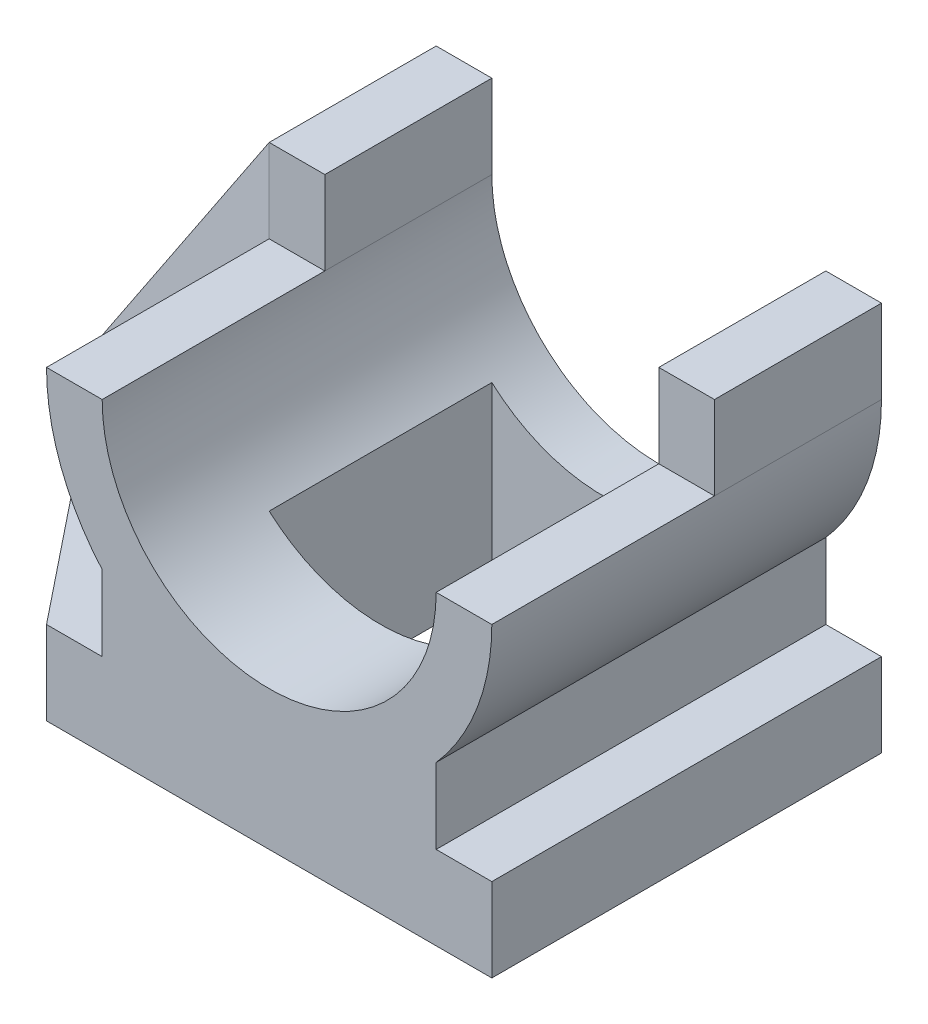
ISO-10303-21;
HEADER;
FILE_DESCRIPTION(('STEP AP214'),'2;1');
FILE_NAME('part.step','',(''),(''),'','','');
FILE_SCHEMA(('AUTOMOTIVE_DESIGN { 1 0 10303 214 1 1 1 1 }'));
ENDSEC;
DATA;
#1=APPLICATION_CONTEXT('core data for automotive mechanical design processes');
#2=APPLICATION_PROTOCOL_DEFINITION('international standard','automotive_design',2000,#1);
#3=PRODUCT_CONTEXT('',#1,'mechanical');
#4=PRODUCT('Part','Part','',(#3));
#5=PRODUCT_RELATED_PRODUCT_CATEGORY('part','',(#4));
#6=PRODUCT_DEFINITION_FORMATION('','',#4);
#7=PRODUCT_DEFINITION_CONTEXT('part definition',#1,'design');
#8=PRODUCT_DEFINITION('design','',#6,#7);
#9=PRODUCT_DEFINITION_SHAPE('','',#8);
#10=(LENGTH_UNIT() NAMED_UNIT(*) SI_UNIT(.MILLI.,.METRE.));
#11=(NAMED_UNIT(*) PLANE_ANGLE_UNIT() SI_UNIT($,.RADIAN.));
#12=(NAMED_UNIT(*) SI_UNIT($,.STERADIAN.) SOLID_ANGLE_UNIT());
#13=UNCERTAINTY_MEASURE_WITH_UNIT(LENGTH_MEASURE(1.E-05),#10,'distance_accuracy_value','');
#14=(GEOMETRIC_REPRESENTATION_CONTEXT(3) GLOBAL_UNCERTAINTY_ASSIGNED_CONTEXT((#13)) GLOBAL_UNIT_ASSIGNED_CONTEXT((#10,
#11,#12)) REPRESENTATION_CONTEXT('',''));
#15=CARTESIAN_POINT('',(0.,0.,0.));
#16=DIRECTION('',(0.,0.,1.));
#17=DIRECTION('',(1.,0.,0.));
#18=AXIS2_PLACEMENT_3D('',#15,#16,#17);
#19=CARTESIAN_POINT('',(160.,0.,30.));
#20=DIRECTION('',(0.,0.,1.));
#21=DIRECTION('',(-1.,0.,0.));
#22=AXIS2_PLACEMENT_3D('',#19,#20,#21);
#23=PLANE('',#22);
#24=DIRECTION('',(1.,0.,0.));
#25=VECTOR('',#24,1.);
#26=CARTESIAN_POINT('',(40.,70.,30.));
#27=LINE('',#26,#25);
#28=CARTESIAN_POINT('',(40.,70.,30.));
#29=VERTEX_POINT('',#28);
#30=CARTESIAN_POINT('',(50.,70.,30.));
#31=VERTEX_POINT('',#30);
#32=EDGE_CURVE('E758',#29,#31,#27,.T.);
#33=ORIENTED_EDGE('',*,*,#32,.F.);
#34=DIRECTION('',(0.,-1.,0.));
#35=VECTOR('',#34,1.);
#36=CARTESIAN_POINT('',(40.,75.,30.));
#37=LINE('',#36,#35);
#38=CARTESIAN_POINT('',(40.,55.,30.));
#39=VERTEX_POINT('',#38);
#40=EDGE_CURVE('E95',#29,#39,#37,.T.);
#41=ORIENTED_EDGE('',*,*,#40,.T.);
#42=DIRECTION('',(-1.,0.,0.));
#43=VECTOR('',#42,1.);
#44=CARTESIAN_POINT('',(50.,55.,30.));
#45=LINE('',#44,#43);
#46=CARTESIAN_POINT('',(50.,55.,30.));
#47=VERTEX_POINT('',#46);
#48=EDGE_CURVE('E430',#47,#39,#45,.T.);
#49=ORIENTED_EDGE('',*,*,#48,.F.);
#50=DIRECTION('',(0.,-1.,0.));
#51=VECTOR('',#50,1.);
#52=CARTESIAN_POINT('',(50.,70.,30.));
#53=LINE('',#52,#51);
#54=EDGE_CURVE('E298',#31,#47,#53,.T.);
#55=ORIENTED_EDGE('',*,*,#54,.F.);
#56=EDGE_LOOP('',(#33,#41,#49,#55));
#57=FACE_BOUND('',#56,.T.);
#58=ADVANCED_FACE('F41',(#57),#23,.T.);
#59=CARTESIAN_POINT('',(80.,55.,30.));
#60=DIRECTION('',(0.,0.,1.));
#61=DIRECTION('',(1.,0.,0.));
#62=AXIS2_PLACEMENT_3D('',#59,#60,#61);
#63=CIRCLE('',#62,40.);
#64=CARTESIAN_POINT('',(50.,28.5424868893541,30.));
#65=VERTEX_POINT('',#64);
#66=EDGE_CURVE('E260',#39,#65,#63,.T.);
#67=ORIENTED_EDGE('',*,*,#66,.F.);
#68=CARTESIAN_POINT('',(40.,15.,30.));
#69=VERTEX_POINT('',#68);
#70=EDGE_CURVE('E508',#39,#69,#37,.T.);
#71=ORIENTED_EDGE('',*,*,#70,.T.);
#72=DIRECTION('',(1.,0.,0.));
#73=VECTOR('',#72,1.);
#74=CARTESIAN_POINT('',(50.,15.,30.));
#75=LINE('',#74,#73);
#76=CARTESIAN_POINT('',(50.,15.,30.));
#77=VERTEX_POINT('',#76);
#78=EDGE_CURVE('E262',#69,#77,#75,.T.);
#79=ORIENTED_EDGE('',*,*,#78,.T.);
#80=DIRECTION('',(0.,1.,0.));
#81=VECTOR('',#80,1.);
#82=CARTESIAN_POINT('',(50.,70.,30.));
#83=LINE('',#82,#81);
#84=EDGE_CURVE('E60',#77,#65,#83,.T.);
#85=ORIENTED_EDGE('',*,*,#84,.T.);
#86=EDGE_LOOP('',(#67,#71,#79,#85));
#87=FACE_BOUND('',#86,.T.);
#88=ADVANCED_FACE('F314',(#87),#23,.T.);
#89=CARTESIAN_POINT('',(0.,15.,30.));
#90=DIRECTION('',(0.808736084303189,-0.588171697675046,0.));
#91=DIRECTION('',(0.588171697675046,0.808736084303189,0.));
#92=AXIS2_PLACEMENT_3D('',#89,#90,#91);
#93=PLANE('',#92);
#94=DIRECTION('',(-0.581914373962646,-0.800132264198639,-0.145478593490662));
#95=VECTOR('',#94,1.);
#96=CARTESIAN_POINT('',(0.846560846560846,16.1640211640212,20.2116402116402));
#97=LINE('',#96,#95);
#98=CARTESIAN_POINT('',(0.,15.,20.));
#99=VERTEX_POINT('',#98);
#100=EDGE_CURVE('E11',#29,#99,#97,.T.);
#101=ORIENTED_EDGE('',*,*,#100,.F.);
#102=DIRECTION('',(0.,0.,-1.));
#103=VECTOR('',#102,1.);
#104=CARTESIAN_POINT('',(40.,70.,30.));
#105=LINE('',#104,#103);
#106=CARTESIAN_POINT('',(40.,70.,0.));
#107=VERTEX_POINT('',#106);
#108=EDGE_CURVE('E235',#29,#107,#105,.T.);
#109=ORIENTED_EDGE('',*,*,#108,.T.);
#110=DIRECTION('',(-0.588171697675046,-0.808736084303189,0.));
#111=VECTOR('',#110,1.);
#112=CARTESIAN_POINT('',(0.,15.,0.));
#113=LINE('',#112,#111);
#114=CARTESIAN_POINT('',(0.,15.,0.));
#115=VERTEX_POINT('',#114);
#116=EDGE_CURVE('E268',#107,#115,#113,.T.);
#117=ORIENTED_EDGE('',*,*,#116,.T.);
#118=DIRECTION('',(0.,0.,1.));
#119=VECTOR('',#118,1.);
#120=CARTESIAN_POINT('',(0.,15.,0.));
#121=LINE('',#120,#119);
#122=EDGE_CURVE('E490',#115,#99,#121,.T.);
#123=ORIENTED_EDGE('',*,*,#122,.T.);
#124=EDGE_LOOP('',(#101,#109,#117,#123));
#125=FACE_BOUND('',#124,.T.);
#126=ADVANCED_FACE('F351',(#125),#93,.F.);
#127=CARTESIAN_POINT('',(50.,28.5424868893541,70.));
#128=DIRECTION('',(1.,0.,0.));
#129=DIRECTION('',(0.,0.,-1.));
#130=AXIS2_PLACEMENT_3D('',#127,#128,#129);
#131=PLANE('',#130);
#132=ORIENTED_EDGE('',*,*,#84,.F.);
#133=DIRECTION('',(0.,0.,-1.));
#134=VECTOR('',#133,1.);
#135=CARTESIAN_POINT('',(50.,15.,70.));
#136=LINE('',#135,#134);
#137=CARTESIAN_POINT('',(50.,15.,70.));
#138=VERTEX_POINT('',#137);
#139=EDGE_CURVE('E485',#138,#77,#136,.T.);
#140=ORIENTED_EDGE('',*,*,#139,.F.);
#141=DIRECTION('',(0.,-1.,0.));
#142=VECTOR('',#141,1.);
#143=CARTESIAN_POINT('',(50.,28.5424868893541,70.));
#144=LINE('',#143,#142);
#145=CARTESIAN_POINT('',(50.,28.5424868893541,70.));
#146=VERTEX_POINT('',#145);
#147=EDGE_CURVE('E473',#146,#138,#144,.T.);
#148=ORIENTED_EDGE('',*,*,#147,.F.);
#149=DIRECTION('',(0.,0.,-1.));
#150=VECTOR('',#149,1.);
#151=CARTESIAN_POINT('',(50.,28.5424868893541,70.));
#152=LINE('',#151,#150);
#153=EDGE_CURVE('E467',#146,#65,#152,.T.);
#154=ORIENTED_EDGE('',*,*,#153,.T.);
#155=EDGE_LOOP('',(#132,#140,#148,#154));
#156=FACE_BOUND('',#155,.T.);
#157=ADVANCED_FACE('F345',(#156),#131,.F.);
#158=CARTESIAN_POINT('',(120.,55.,70.));
#159=DIRECTION('',(0.,-1.,0.));
#160=DIRECTION('',(0.,0.,-1.));
#161=AXIS2_PLACEMENT_3D('',#158,#159,#160);
#162=PLANE('',#161);
#163=DIRECTION('',(0.,0.,-1.));
#164=VECTOR('',#163,1.);
#165=CARTESIAN_POINT('',(50.,55.,70.));
#166=LINE('',#165,#164);
#167=CARTESIAN_POINT('',(50.,55.,70.));
#168=VERTEX_POINT('',#167);
#169=EDGE_CURVE('E283',#168,#47,#166,.T.);
#170=ORIENTED_EDGE('',*,*,#169,.T.);
#171=ORIENTED_EDGE('',*,*,#48,.T.);
#172=DIRECTION('',(0.,0.,-1.));
#173=VECTOR('',#172,1.);
#174=CARTESIAN_POINT('',(40.,55.,70.));
#175=LINE('',#174,#173);
#176=CARTESIAN_POINT('',(40.,55.,70.));
#177=VERTEX_POINT('',#176);
#178=EDGE_CURVE('E451',#177,#39,#175,.T.);
#179=ORIENTED_EDGE('',*,*,#178,.F.);
#180=DIRECTION('',(-1.,0.,0.));
#181=VECTOR('',#180,1.);
#182=CARTESIAN_POINT('',(120.,55.,70.));
#183=LINE('',#182,#181);
#184=EDGE_CURVE('E455',#168,#177,#183,.T.);
#185=ORIENTED_EDGE('',*,*,#184,.F.);
#186=EDGE_LOOP('',(#170,#171,#179,#185));
#187=FACE_BOUND('',#186,.T.);
#188=ADVANCED_FACE('F340',(#187),#162,.F.);
#189=DIRECTION('',(0.,0.,-1.));
#190=VECTOR('',#189,1.);
#191=CARTESIAN_POINT('',(110.,55.,70.));
#192=LINE('',#191,#190);
#193=CARTESIAN_POINT('',(110.,55.,70.));
#194=VERTEX_POINT('',#193);
#195=CARTESIAN_POINT('',(110.,55.,30.));
#196=VERTEX_POINT('',#195);
#197=EDGE_CURVE('E278',#194,#196,#192,.T.);
#198=ORIENTED_EDGE('',*,*,#197,.F.);
#199=CARTESIAN_POINT('',(120.,55.,70.));
#200=VERTEX_POINT('',#199);
#201=EDGE_CURVE('E457',#200,#194,#183,.T.);
#202=ORIENTED_EDGE('',*,*,#201,.F.);
#203=DIRECTION('',(0.,0.,-1.));
#204=VECTOR('',#203,1.);
#205=CARTESIAN_POINT('',(120.,55.,70.));
#206=LINE('',#205,#204);
#207=CARTESIAN_POINT('',(120.,55.,30.));
#208=VERTEX_POINT('',#207);
#209=EDGE_CURVE('E475',#200,#208,#206,.T.);
#210=ORIENTED_EDGE('',*,*,#209,.T.);
#211=DIRECTION('',(1.,0.,0.));
#212=VECTOR('',#211,1.);
#213=CARTESIAN_POINT('',(110.,55.,30.));
#214=LINE('',#213,#212);
#215=EDGE_CURVE('E742',#196,#208,#214,.T.);
#216=ORIENTED_EDGE('',*,*,#215,.F.);
#217=EDGE_LOOP('',(#198,#202,#210,#216));
#218=FACE_BOUND('',#217,.T.);
#219=ADVANCED_FACE('F344',(#218),#162,.F.);
#220=CARTESIAN_POINT('',(120.,15.,0.));
#221=DIRECTION('',(0.,0.,1.));
#222=DIRECTION('',(1.,0.,0.));
#223=AXIS2_PLACEMENT_3D('',#220,#221,#222);
#224=PLANE('',#223);
#225=DIRECTION('',(0.,-1.,0.));
#226=VECTOR('',#225,1.);
#227=CARTESIAN_POINT('',(0.,15.,0.));
#228=LINE('',#227,#226);
#229=CARTESIAN_POINT('',(0.,0.,0.));
#230=VERTEX_POINT('',#229);
#231=EDGE_CURVE('E245',#115,#230,#228,.T.);
#232=ORIENTED_EDGE('',*,*,#231,.F.);
#233=ORIENTED_EDGE('',*,*,#116,.F.);
#234=DIRECTION('',(1.,0.,0.));
#235=VECTOR('',#234,1.);
#236=CARTESIAN_POINT('',(40.,70.,0.));
#237=LINE('',#236,#235);
#238=CARTESIAN_POINT('',(50.,70.,0.));
#239=VERTEX_POINT('',#238);
#240=EDGE_CURVE('E423',#107,#239,#237,.T.);
#241=ORIENTED_EDGE('',*,*,#240,.T.);
#242=DIRECTION('',(0.,1.,0.));
#243=VECTOR('',#242,1.);
#244=CARTESIAN_POINT('',(50.,15.,0.));
#245=LINE('',#244,#243);
#246=CARTESIAN_POINT('',(50.,55.,-6.E-06));
#247=VERTEX_POINT('',#246);
#248=EDGE_CURVE('E424',#239,#247,#245,.F.);
#249=ORIENTED_EDGE('',*,*,#248,.T.);
#250=CARTESIAN_POINT('',(50.,55.,0.));
#251=CARTESIAN_POINT('',(50.,52.0455229689365,0.));
#252=CARTESIAN_POINT('',(50.5764415879031,49.1472903395161,0.));
#253=CARTESIAN_POINT('',(51.1527300478078,46.2498276069436,0.));
#254=CARTESIAN_POINT('',(52.2836140246614,43.5194970290473,0.));
#255=CARTESIAN_POINT('',(53.4140962009013,40.7901365316584,0.));
#256=CARTESIAN_POINT('',(55.0559116309236,38.3328930094119,0.));
#257=CARTESIAN_POINT('',(56.6971437275153,35.8765225404136,0.));
#258=CARTESIAN_POINT('',(58.7867965644036,33.7867965644036,0.));
#259=CARTESIAN_POINT('',(60.875706952208,31.6978130634636,0.));
#260=CARTESIAN_POINT('',(63.3328930094119,30.0559116309236,0.));
#261=CARTESIAN_POINT('',(65.7892060337397,28.4145935624012,0.));
#262=CARTESIAN_POINT('',(68.5194970290473,27.2836140246614,0.));
#263=CARTESIAN_POINT('',(71.2488179579036,26.1530363214911,0.));
#264=CARTESIAN_POINT('',(74.1472903395162,25.5764415879031,0.));
#265=CARTESIAN_POINT('',(77.0447329001322,25.0000517171824,0.));
#266=CARTESIAN_POINT('',(80.,25.,0.));
#267=CARTESIAN_POINT('',(82.954217099834,24.9999483011926,0.));
#268=CARTESIAN_POINT('',(85.8527096604839,25.5764415879031,0.));
#269=CARTESIAN_POINT('',(88.7501723931018,26.1527300478168,0.));
#270=CARTESIAN_POINT('',(91.4805029709527,27.2836140246614,0.));
#271=CARTESIAN_POINT('',(94.2098634684444,28.4140962009536,0.));
#272=CARTESIAN_POINT('',(96.6671069905881,30.0559116309236,0.));
#273=CARTESIAN_POINT('',(99.1234774595179,31.6971437274859,0.));
#274=CARTESIAN_POINT('',(101.213203435596,33.7867965644036,0.));
#275=CARTESIAN_POINT('',(103.302186936448,35.8757069520806,0.));
#276=CARTESIAN_POINT('',(104.944088369076,38.3328930094119,0.));
#277=CARTESIAN_POINT('',(106.585406437491,40.7892060335734,0.));
#278=CARTESIAN_POINT('',(107.716385975339,43.5194970290473,0.));
#279=CARTESIAN_POINT('',(108.84696367845,46.2488179576676,0.));
#280=CARTESIAN_POINT('',(109.423558412097,49.1472903395162,0.));
#281=CARTESIAN_POINT('',(110.,52.0449928761295,0.));
#282=CARTESIAN_POINT('',(110.,55.,0.));
#283=B_SPLINE_CURVE_WITH_KNOTS('',2,(#250,#251,#252,#253,#254,#255,#256,#257,#258,#259,#260,
#261,#262,#263,#264,#265,#266,#267,#268,#269,#270,#271,#272,#273,#274,#275,#276,#277,#278,#279,
#280,#281,#282),.UNSPECIFIED.,.F.,.F.,(3,2,2,2,2,2,2,2,2,2,2,2,2,2,2,2,3),(0.,0.0625,0.125,
0.1875,0.25,0.3125,0.375,0.4375,0.5,0.5625,0.625,0.6875,0.75,0.8125,0.875,0.9375,1.),.UNSPECIFIED.);
#284=CARTESIAN_POINT('',(110.,55.,-6.E-06));
#285=VERTEX_POINT('',#284);
#286=EDGE_CURVE('E227',#247,#285,#283,.T.);
#287=ORIENTED_EDGE('',*,*,#286,.T.);
#288=DIRECTION('',(0.,1.,0.));
#289=VECTOR('',#288,1.);
#290=CARTESIAN_POINT('',(110.,70.,0.));
#291=LINE('',#290,#289);
#292=CARTESIAN_POINT('',(110.,70.,0.));
#293=VERTEX_POINT('',#292);
#294=EDGE_CURVE('E222',#293,#285,#291,.F.);
#295=ORIENTED_EDGE('',*,*,#294,.F.);
#296=DIRECTION('',(-1.,0.,0.));
#297=VECTOR('',#296,1.);
#298=CARTESIAN_POINT('',(120.,70.,0.));
#299=LINE('',#298,#297);
#300=CARTESIAN_POINT('',(120.,70.,0.));
#301=VERTEX_POINT('',#300);
#302=EDGE_CURVE('E201',#301,#293,#299,.T.);
#303=ORIENTED_EDGE('',*,*,#302,.F.);
#304=DIRECTION('',(0.,1.,0.));
#305=VECTOR('',#304,1.);
#306=CARTESIAN_POINT('',(120.,55.,0.));
#307=LINE('',#306,#305);
#308=CARTESIAN_POINT('',(120.,55.,0.));
#309=VERTEX_POINT('',#308);
#310=EDGE_CURVE('E214',#309,#301,#307,.T.);
#311=ORIENTED_EDGE('',*,*,#310,.F.);
#312=CARTESIAN_POINT('',(80.,55.,0.));
#313=DIRECTION('',(0.,0.,1.));
#314=DIRECTION('',(1.,0.,0.));
#315=AXIS2_PLACEMENT_3D('',#312,#313,#314);
#316=CIRCLE('',#315,40.);
#317=CARTESIAN_POINT('',(110.,28.5424868893541,0.));
#318=VERTEX_POINT('',#317);
#319=EDGE_CURVE('E470',#318,#309,#316,.T.);
#320=ORIENTED_EDGE('',*,*,#319,.F.);
#321=DIRECTION('',(0.,1.,0.));
#322=VECTOR('',#321,1.);
#323=CARTESIAN_POINT('',(110.,15.,0.));
#324=LINE('',#323,#322);
#325=CARTESIAN_POINT('',(110.,15.,0.));
#326=VERTEX_POINT('',#325);
#327=EDGE_CURVE('E435',#326,#318,#324,.T.);
#328=ORIENTED_EDGE('',*,*,#327,.F.);
#329=DIRECTION('',(-1.,0.,0.));
#330=VECTOR('',#329,1.);
#331=CARTESIAN_POINT('',(120.,15.,0.));
#332=LINE('',#331,#330);
#333=CARTESIAN_POINT('',(120.,15.,0.));
#334=VERTEX_POINT('',#333);
#335=EDGE_CURVE('E412',#334,#326,#332,.T.);
#336=ORIENTED_EDGE('',*,*,#335,.F.);
#337=DIRECTION('',(0.,-1.,0.));
#338=VECTOR('',#337,1.);
#339=CARTESIAN_POINT('',(120.,15.,0.));
#340=LINE('',#339,#338);
#341=CARTESIAN_POINT('',(120.,0.,0.));
#342=VERTEX_POINT('',#341);
#343=EDGE_CURVE('E414',#334,#342,#340,.T.);
#344=ORIENTED_EDGE('',*,*,#343,.T.);
#345=DIRECTION('',(-1.,0.,0.));
#346=VECTOR('',#345,1.);
#347=CARTESIAN_POINT('',(120.,0.,0.));
#348=LINE('',#347,#346);
#349=EDGE_CURVE('E391',#342,#230,#348,.T.);
#350=ORIENTED_EDGE('',*,*,#349,.T.);
#351=EDGE_LOOP('',(#232,#233,#241,#249,#287,#295,#303,#311,#320,#328,#336,#344,#350));
#352=FACE_BOUND('',#351,.T.);
#353=ADVANCED_FACE('F43',(#352),#224,.F.);
#354=CARTESIAN_POINT('',(0.,15.,0.));
#355=DIRECTION('',(0.,1.,0.));
#356=DIRECTION('',(0.,0.,1.));
#357=AXIS2_PLACEMENT_3D('',#354,#355,#356);
#358=PLANE('',#357);
#359=ORIENTED_EDGE('',*,*,#78,.F.);
#360=DIRECTION('',(-0.970142500145332,0.,-0.242535625036333));
#361=VECTOR('',#360,1.);
#362=CARTESIAN_POINT('',(0.,15.,20.));
#363=LINE('',#362,#361);
#364=EDGE_CURVE('E507',#69,#99,#363,.T.);
#365=ORIENTED_EDGE('',*,*,#364,.T.);
#366=DIRECTION('',(0.624695047554424,0.,0.78086880944303));
#367=VECTOR('',#366,1.);
#368=CARTESIAN_POINT('',(0.,15.,20.));
#369=LINE('',#368,#367);
#370=CARTESIAN_POINT('',(40.,15.,70.));
#371=VERTEX_POINT('',#370);
#372=EDGE_CURVE('E396',#99,#371,#369,.T.);
#373=ORIENTED_EDGE('',*,*,#372,.T.);
#374=DIRECTION('',(1.,0.,0.));
#375=VECTOR('',#374,1.);
#376=CARTESIAN_POINT('',(40.,15.,70.));
#377=LINE('',#376,#375);
#378=EDGE_CURVE('E495',#371,#138,#377,.T.);
#379=ORIENTED_EDGE('',*,*,#378,.T.);
#380=ORIENTED_EDGE('',*,*,#139,.T.);
#381=EDGE_LOOP('',(#359,#365,#373,#379,#380));
#382=FACE_BOUND('',#381,.T.);
#383=ADVANCED_FACE('F362',(#382),#358,.T.);
#384=CARTESIAN_POINT('',(0.,15.,0.));
#385=DIRECTION('',(1.,0.,0.));
#386=DIRECTION('',(0.,0.,-1.));
#387=AXIS2_PLACEMENT_3D('',#384,#385,#386);
#388=PLANE('',#387);
#389=DIRECTION('',(0.,0.,1.));
#390=VECTOR('',#389,1.);
#391=CARTESIAN_POINT('',(0.,0.,0.));
#392=LINE('',#391,#390);
#393=CARTESIAN_POINT('',(0.,0.,20.));
#394=VERTEX_POINT('',#393);
#395=EDGE_CURVE('E383',#230,#394,#392,.T.);
#396=ORIENTED_EDGE('',*,*,#395,.T.);
#397=DIRECTION('',(0.,-1.,0.));
#398=VECTOR('',#397,1.);
#399=CARTESIAN_POINT('',(0.,15.,20.));
#400=LINE('',#399,#398);
#401=EDGE_CURVE('E389',#99,#394,#400,.T.);
#402=ORIENTED_EDGE('',*,*,#401,.F.);
#403=ORIENTED_EDGE('',*,*,#122,.F.);
#404=ORIENTED_EDGE('',*,*,#231,.T.);
#405=EDGE_LOOP('',(#396,#402,#403,#404));
#406=FACE_BOUND('',#405,.T.);
#407=ADVANCED_FACE('F372',(#406),#388,.F.);
#408=CARTESIAN_POINT('',(0.,15.,20.));
#409=DIRECTION('',(0.78086880944303,0.,-0.624695047554424));
#410=DIRECTION('',(-0.624695047554424,0.,-0.78086880944303));
#411=AXIS2_PLACEMENT_3D('',#408,#409,#410);
#412=PLANE('',#411);
#413=DIRECTION('',(0.624695047554424,0.,0.78086880944303));
#414=VECTOR('',#413,1.);
#415=CARTESIAN_POINT('',(0.,0.,20.));
#416=LINE('',#415,#414);
#417=CARTESIAN_POINT('',(40.,0.,70.));
#418=VERTEX_POINT('',#417);
#419=EDGE_CURVE('E395',#394,#418,#416,.T.);
#420=ORIENTED_EDGE('',*,*,#419,.T.);
#421=DIRECTION('',(0.,-1.,0.));
#422=VECTOR('',#421,1.);
#423=CARTESIAN_POINT('',(40.,15.,70.));
#424=LINE('',#423,#422);
#425=EDGE_CURVE('E398',#371,#418,#424,.T.);
#426=ORIENTED_EDGE('',*,*,#425,.F.);
#427=ORIENTED_EDGE('',*,*,#372,.F.);
#428=ORIENTED_EDGE('',*,*,#401,.T.);
#429=EDGE_LOOP('',(#420,#426,#427,#428));
#430=FACE_BOUND('',#429,.T.);
#431=ADVANCED_FACE('F371',(#430),#412,.F.);
#432=CARTESIAN_POINT('',(40.,15.,70.));
#433=DIRECTION('',(0.,0.,-1.));
#434=DIRECTION('',(-1.,0.,0.));
#435=AXIS2_PLACEMENT_3D('',#432,#433,#434);
#436=PLANE('',#435);
#437=CARTESIAN_POINT('',(80.,55.,70.));
#438=DIRECTION('',(0.,0.,1.));
#439=DIRECTION('',(1.,0.,0.));
#440=AXIS2_PLACEMENT_3D('',#437,#438,#439);
#441=CIRCLE('',#440,30.);
#442=EDGE_CURVE('E275',#168,#194,#441,.T.);
#443=ORIENTED_EDGE('',*,*,#442,.F.);
#444=ORIENTED_EDGE('',*,*,#184,.T.);
#445=CARTESIAN_POINT('',(80.,55.,70.));
#446=DIRECTION('',(0.,0.,1.));
#447=DIRECTION('',(1.,0.,0.));
#448=AXIS2_PLACEMENT_3D('',#445,#446,#447);
#449=CIRCLE('',#448,40.);
#450=EDGE_CURVE('E458',#177,#146,#449,.T.);
#451=ORIENTED_EDGE('',*,*,#450,.T.);
#452=ORIENTED_EDGE('',*,*,#147,.T.);
#453=ORIENTED_EDGE('',*,*,#378,.F.);
#454=ORIENTED_EDGE('',*,*,#425,.T.);
#455=DIRECTION('',(1.,0.,0.));
#456=VECTOR('',#455,1.);
#457=CARTESIAN_POINT('',(40.,0.,70.));
#458=LINE('',#457,#456);
#459=CARTESIAN_POINT('',(120.,0.,70.));
#460=VERTEX_POINT('',#459);
#461=EDGE_CURVE('E404',#418,#460,#458,.T.);
#462=ORIENTED_EDGE('',*,*,#461,.T.);
#463=DIRECTION('',(0.,-1.,0.));
#464=VECTOR('',#463,1.);
#465=CARTESIAN_POINT('',(120.,15.,70.));
#466=LINE('',#465,#464);
#467=CARTESIAN_POINT('',(120.,15.,70.));
#468=VERTEX_POINT('',#467);
#469=EDGE_CURVE('E413',#468,#460,#466,.T.);
#470=ORIENTED_EDGE('',*,*,#469,.F.);
#471=CARTESIAN_POINT('',(110.,15.,70.));
#472=VERTEX_POINT('',#471);
#473=EDGE_CURVE('E491',#472,#468,#377,.T.);
#474=ORIENTED_EDGE('',*,*,#473,.F.);
#475=DIRECTION('',(0.,1.,0.));
#476=VECTOR('',#475,1.);
#477=CARTESIAN_POINT('',(110.,15.,70.));
#478=LINE('',#477,#476);
#479=CARTESIAN_POINT('',(110.,28.5424868893541,70.));
#480=VERTEX_POINT('',#479);
#481=EDGE_CURVE('E463',#472,#480,#478,.T.);
#482=ORIENTED_EDGE('',*,*,#481,.T.);
#483=CARTESIAN_POINT('',(80.,55.,70.));
#484=DIRECTION('',(0.,0.,1.));
#485=DIRECTION('',(1.,0.,0.));
#486=AXIS2_PLACEMENT_3D('',#483,#484,#485);
#487=CIRCLE('',#486,40.);
#488=EDGE_CURVE('E460',#480,#200,#487,.T.);
#489=ORIENTED_EDGE('',*,*,#488,.T.);
#490=ORIENTED_EDGE('',*,*,#201,.T.);
#491=EDGE_LOOP('',(#443,#444,#451,#452,#453,#454,#462,#470,#474,#482,#489,#490));
#492=FACE_BOUND('',#491,.T.);
#493=ADVANCED_FACE('F370',(#492),#436,.F.);
#494=CARTESIAN_POINT('',(120.,15.,70.));
#495=DIRECTION('',(-1.,0.,0.));
#496=DIRECTION('',(0.,0.,1.));
#497=AXIS2_PLACEMENT_3D('',#494,#495,#496);
#498=PLANE('',#497);
#499=DIRECTION('',(0.,0.,-1.));
#500=VECTOR('',#499,1.);
#501=CARTESIAN_POINT('',(120.,0.,70.));
#502=LINE('',#501,#500);
#503=EDGE_CURVE('E408',#460,#342,#502,.T.);
#504=ORIENTED_EDGE('',*,*,#503,.T.);
#505=ORIENTED_EDGE('',*,*,#343,.F.);
#506=DIRECTION('',(0.,0.,-1.));
#507=VECTOR('',#506,1.);
#508=CARTESIAN_POINT('',(120.,15.,70.));
#509=LINE('',#508,#507);
#510=EDGE_CURVE('E418',#468,#334,#509,.T.);
#511=ORIENTED_EDGE('',*,*,#510,.F.);
#512=ORIENTED_EDGE('',*,*,#469,.T.);
#513=EDGE_LOOP('',(#504,#505,#511,#512));
#514=FACE_BOUND('',#513,.T.);
#515=ADVANCED_FACE('F358',(#514),#498,.F.);
#516=DIRECTION('',(0.,0.,-1.));
#517=VECTOR('',#516,1.);
#518=CARTESIAN_POINT('',(110.,15.,70.));
#519=LINE('',#518,#517);
#520=EDGE_CURVE('E477',#472,#326,#519,.T.);
#521=ORIENTED_EDGE('',*,*,#520,.F.);
#522=ORIENTED_EDGE('',*,*,#473,.T.);
#523=ORIENTED_EDGE('',*,*,#510,.T.);
#524=ORIENTED_EDGE('',*,*,#335,.T.);
#525=EDGE_LOOP('',(#521,#522,#523,#524));
#526=FACE_BOUND('',#525,.T.);
#527=ADVANCED_FACE('F359',(#526),#358,.T.);
#528=CARTESIAN_POINT('',(0.,0.,0.));
#529=DIRECTION('',(0.,1.,0.));
#530=DIRECTION('',(0.,0.,1.));
#531=AXIS2_PLACEMENT_3D('',#528,#529,#530);
#532=PLANE('',#531);
#533=DIRECTION('',(1.,0.,0.));
#534=VECTOR('',#533,1.);
#535=CARTESIAN_POINT('',(0.,0.,10.));
#536=LINE('',#535,#534);
#537=CARTESIAN_POINT('',(100.,0.,10.));
#538=VERTEX_POINT('',#537);
#539=CARTESIAN_POINT('',(60.,0.,10.));
#540=VERTEX_POINT('',#539);
#541=EDGE_CURVE('E255',#538,#540,#536,.F.);
#542=ORIENTED_EDGE('',*,*,#541,.T.);
#543=DIRECTION('',(0.,0.,1.));
#544=VECTOR('',#543,1.);
#545=CARTESIAN_POINT('',(60.,0.,0.));
#546=LINE('',#545,#544);
#547=CARTESIAN_POINT('',(60.,0.,50.));
#548=VERTEX_POINT('',#547);
#549=EDGE_CURVE('E252',#540,#548,#546,.T.);
#550=ORIENTED_EDGE('',*,*,#549,.T.);
#551=DIRECTION('',(1.,0.,0.));
#552=VECTOR('',#551,1.);
#553=CARTESIAN_POINT('',(0.,0.,50.));
#554=LINE('',#553,#552);
#555=CARTESIAN_POINT('',(100.,0.,50.));
#556=VERTEX_POINT('',#555);
#557=EDGE_CURVE('E246',#548,#556,#554,.T.);
#558=ORIENTED_EDGE('',*,*,#557,.T.);
#559=DIRECTION('',(0.,0.,1.));
#560=VECTOR('',#559,1.);
#561=CARTESIAN_POINT('',(100.,0.,0.));
#562=LINE('',#561,#560);
#563=EDGE_CURVE('E67',#556,#538,#562,.F.);
#564=ORIENTED_EDGE('',*,*,#563,.T.);
#565=EDGE_LOOP('',(#542,#550,#558,#564));
#566=FACE_BOUND('',#565,.T.);
#567=ORIENTED_EDGE('',*,*,#349,.F.);
#568=ORIENTED_EDGE('',*,*,#503,.F.);
#569=ORIENTED_EDGE('',*,*,#461,.F.);
#570=ORIENTED_EDGE('',*,*,#419,.F.);
#571=ORIENTED_EDGE('',*,*,#395,.F.);
#572=EDGE_LOOP('',(#567,#568,#569,#570,#571));
#573=FACE_BOUND('',#572,.T.);
#574=ADVANCED_FACE('F353',(#566,#573),#532,.F.);
#575=CARTESIAN_POINT('',(110.,15.,70.));
#576=DIRECTION('',(-1.,0.,0.));
#577=DIRECTION('',(0.,0.,1.));
#578=AXIS2_PLACEMENT_3D('',#575,#576,#577);
#579=PLANE('',#578);
#580=ORIENTED_EDGE('',*,*,#327,.T.);
#581=DIRECTION('',(0.,0.,-1.));
#582=VECTOR('',#581,1.);
#583=CARTESIAN_POINT('',(110.,28.5424868893541,70.));
#584=LINE('',#583,#582);
#585=EDGE_CURVE('E480',#480,#318,#584,.T.);
#586=ORIENTED_EDGE('',*,*,#585,.F.);
#587=ORIENTED_EDGE('',*,*,#481,.F.);
#588=ORIENTED_EDGE('',*,*,#520,.T.);
#589=EDGE_LOOP('',(#580,#586,#587,#588));
#590=FACE_BOUND('',#589,.T.);
#591=ADVANCED_FACE('F350',(#590),#579,.F.);
#592=CARTESIAN_POINT('',(80.,55.,70.));
#593=DIRECTION('',(0.,0.,-1.));
#594=DIRECTION('',(-1.,0.,0.));
#595=AXIS2_PLACEMENT_3D('',#592,#593,#594);
#596=CYLINDRICAL_SURFACE('',#595,40.);
#597=ORIENTED_EDGE('',*,*,#319,.T.);
#598=DIRECTION('',(0.,0.,-1.));
#599=VECTOR('',#598,1.);
#600=CARTESIAN_POINT('',(120.,55.,30.));
#601=LINE('',#600,#599);
#602=EDGE_CURVE('E433',#208,#309,#601,.T.);
#603=ORIENTED_EDGE('',*,*,#602,.F.);
#604=ORIENTED_EDGE('',*,*,#209,.F.);
#605=ORIENTED_EDGE('',*,*,#488,.F.);
#606=ORIENTED_EDGE('',*,*,#585,.T.);
#607=EDGE_LOOP('',(#597,#603,#604,#605,#606));
#608=FACE_BOUND('',#607,.T.);
#609=ADVANCED_FACE('F337',(#608),#596,.T.);
#610=CARTESIAN_POINT('',(80.,55.,70.));
#611=DIRECTION('',(0.,0.,-1.));
#612=DIRECTION('',(-1.,0.,0.));
#613=AXIS2_PLACEMENT_3D('',#610,#611,#612);
#614=CYLINDRICAL_SURFACE('',#613,40.);
#615=ORIENTED_EDGE('',*,*,#178,.T.);
#616=ORIENTED_EDGE('',*,*,#66,.T.);
#617=ORIENTED_EDGE('',*,*,#153,.F.);
#618=ORIENTED_EDGE('',*,*,#450,.F.);
#619=EDGE_LOOP('',(#615,#616,#617,#618));
#620=FACE_BOUND('',#619,.T.);
#621=ADVANCED_FACE('F333',(#620),#614,.T.);
#622=CARTESIAN_POINT('',(110.,70.,30.));
#623=DIRECTION('',(1.,0.,0.));
#624=DIRECTION('',(0.,0.,-1.));
#625=AXIS2_PLACEMENT_3D('',#622,#623,#624);
#626=PLANE('',#625);
#627=ORIENTED_EDGE('',*,*,#294,.T.);
#628=DIRECTION('',(0.,0.,-1.));
#629=VECTOR('',#628,1.);
#630=CARTESIAN_POINT('',(110.,55.,30.));
#631=LINE('',#630,#629);
#632=EDGE_CURVE('E429',#196,#285,#631,.T.);
#633=ORIENTED_EDGE('',*,*,#632,.F.);
#634=DIRECTION('',(0.,-1.,0.));
#635=VECTOR('',#634,1.);
#636=CARTESIAN_POINT('',(110.,70.,30.));
#637=LINE('',#636,#635);
#638=CARTESIAN_POINT('',(110.,70.,30.));
#639=VERTEX_POINT('',#638);
#640=EDGE_CURVE('E212',#639,#196,#637,.T.);
#641=ORIENTED_EDGE('',*,*,#640,.F.);
#642=DIRECTION('',(0.,0.,-1.));
#643=VECTOR('',#642,1.);
#644=CARTESIAN_POINT('',(110.,70.,30.));
#645=LINE('',#644,#643);
#646=EDGE_CURVE('E210',#639,#293,#645,.T.);
#647=ORIENTED_EDGE('',*,*,#646,.T.);
#648=EDGE_LOOP('',(#627,#633,#641,#647));
#649=FACE_BOUND('',#648,.T.);
#650=ADVANCED_FACE('F218',(#649),#626,.F.);
#651=CARTESIAN_POINT('',(120.,55.,30.));
#652=DIRECTION('',(-1.,0.,0.));
#653=DIRECTION('',(0.,0.,1.));
#654=AXIS2_PLACEMENT_3D('',#651,#652,#653);
#655=PLANE('',#654);
#656=ORIENTED_EDGE('',*,*,#310,.T.);
#657=DIRECTION('',(0.,0.,-1.));
#658=VECTOR('',#657,1.);
#659=CARTESIAN_POINT('',(120.,70.,30.));
#660=LINE('',#659,#658);
#661=CARTESIAN_POINT('',(120.,70.,30.));
#662=VERTEX_POINT('',#661);
#663=EDGE_CURVE('E209',#662,#301,#660,.T.);
#664=ORIENTED_EDGE('',*,*,#663,.F.);
#665=DIRECTION('',(0.,1.,0.));
#666=VECTOR('',#665,1.);
#667=CARTESIAN_POINT('',(120.,55.,30.));
#668=LINE('',#667,#666);
#669=EDGE_CURVE('E751',#208,#662,#668,.T.);
#670=ORIENTED_EDGE('',*,*,#669,.F.);
#671=ORIENTED_EDGE('',*,*,#602,.T.);
#672=EDGE_LOOP('',(#656,#664,#670,#671));
#673=FACE_BOUND('',#672,.T.);
#674=ADVANCED_FACE('F328',(#673),#655,.F.);
#675=CARTESIAN_POINT('',(120.,70.,30.));
#676=DIRECTION('',(0.,-1.,0.));
#677=DIRECTION('',(0.,0.,-1.));
#678=AXIS2_PLACEMENT_3D('',#675,#676,#677);
#679=PLANE('',#678);
#680=ORIENTED_EDGE('',*,*,#302,.T.);
#681=ORIENTED_EDGE('',*,*,#646,.F.);
#682=DIRECTION('',(-1.,0.,0.));
#683=VECTOR('',#682,1.);
#684=CARTESIAN_POINT('',(120.,70.,30.));
#685=LINE('',#684,#683);
#686=EDGE_CURVE('E224',#662,#639,#685,.T.);
#687=ORIENTED_EDGE('',*,*,#686,.F.);
#688=ORIENTED_EDGE('',*,*,#663,.T.);
#689=EDGE_LOOP('',(#680,#681,#687,#688));
#690=FACE_BOUND('',#689,.T.);
#691=ADVANCED_FACE('F202',(#690),#679,.F.);
#692=CARTESIAN_POINT('',(0.,0.,30.));
#693=DIRECTION('',(0.,0.,1.));
#694=DIRECTION('',(1.,0.,0.));
#695=AXIS2_PLACEMENT_3D('',#692,#693,#694);
#696=PLANE('',#695);
#697=ORIENTED_EDGE('',*,*,#640,.T.);
#698=ORIENTED_EDGE('',*,*,#215,.T.);
#699=ORIENTED_EDGE('',*,*,#669,.T.);
#700=ORIENTED_EDGE('',*,*,#686,.T.);
#701=EDGE_LOOP('',(#697,#698,#699,#700));
#702=FACE_BOUND('',#701,.T.);
#703=ADVANCED_FACE('F325',(#702),#696,.T.);
#704=CARTESIAN_POINT('',(50.,70.,30.));
#705=DIRECTION('',(1.,0.,0.));
#706=DIRECTION('',(0.,0.,-1.));
#707=AXIS2_PLACEMENT_3D('',#704,#705,#706);
#708=PLANE('',#707);
#709=ORIENTED_EDGE('',*,*,#248,.F.);
#710=DIRECTION('',(0.,0.,-1.));
#711=VECTOR('',#710,1.);
#712=CARTESIAN_POINT('',(50.,70.,30.));
#713=LINE('',#712,#711);
#714=EDGE_CURVE('E226',#31,#239,#713,.T.);
#715=ORIENTED_EDGE('',*,*,#714,.F.);
#716=ORIENTED_EDGE('',*,*,#54,.T.);
#717=DIRECTION('',(0.,0.,-1.));
#718=VECTOR('',#717,1.);
#719=CARTESIAN_POINT('',(50.,55.,30.));
#720=LINE('',#719,#718);
#721=EDGE_CURVE('E422',#47,#247,#720,.T.);
#722=ORIENTED_EDGE('',*,*,#721,.T.);
#723=EDGE_LOOP('',(#709,#715,#716,#722));
#724=FACE_BOUND('',#723,.T.);
#725=ADVANCED_FACE('F318',(#724),#708,.T.);
#726=CARTESIAN_POINT('',(40.,70.,30.));
#727=DIRECTION('',(0.,1.,0.));
#728=DIRECTION('',(0.,0.,1.));
#729=AXIS2_PLACEMENT_3D('',#726,#727,#728);
#730=PLANE('',#729);
#731=ORIENTED_EDGE('',*,*,#240,.F.);
#732=ORIENTED_EDGE('',*,*,#108,.F.);
#733=ORIENTED_EDGE('',*,*,#32,.T.);
#734=ORIENTED_EDGE('',*,*,#714,.T.);
#735=EDGE_LOOP('',(#731,#732,#733,#734));
#736=FACE_BOUND('',#735,.T.);
#737=ADVANCED_FACE('F310',(#736),#730,.T.);
#738=CARTESIAN_POINT('',(80.,55.,70.));
#739=DIRECTION('',(0.,0.,-1.));
#740=DIRECTION('',(-1.,0.,0.));
#741=AXIS2_PLACEMENT_3D('',#738,#739,#740);
#742=CYLINDRICAL_SURFACE('',#741,30.);
#743=DIRECTION('',(0.,0.,-1.));
#744=VECTOR('',#743,1.);
#745=CARTESIAN_POINT('',(60.,32.6393202250021,70.));
#746=LINE('',#745,#744);
#747=CARTESIAN_POINT('',(60.,32.6393202250021,10.));
#748=VERTEX_POINT('',#747);
#749=CARTESIAN_POINT('',(60.,32.6393202250021,50.));
#750=VERTEX_POINT('',#749);
#751=EDGE_CURVE('E49',#748,#750,#746,.F.);
#752=ORIENTED_EDGE('',*,*,#751,.F.);
#753=CARTESIAN_POINT('',(80.,55.,10.));
#754=DIRECTION('',(0.,0.,-1.));
#755=DIRECTION('',(-1.,0.,0.));
#756=AXIS2_PLACEMENT_3D('',#753,#754,#755);
#757=CIRCLE('',#756,30.);
#758=CARTESIAN_POINT('',(100.,32.6393202250021,10.));
#759=VERTEX_POINT('',#758);
#760=EDGE_CURVE('E247',#759,#748,#757,.T.);
#761=ORIENTED_EDGE('',*,*,#760,.F.);
#762=DIRECTION('',(0.,0.,-1.));
#763=VECTOR('',#762,1.);
#764=CARTESIAN_POINT('',(100.,32.6393202250021,70.));
#765=LINE('',#764,#763);
#766=CARTESIAN_POINT('',(100.,32.6393202250021,50.));
#767=VERTEX_POINT('',#766);
#768=EDGE_CURVE('E242',#767,#759,#765,.T.);
#769=ORIENTED_EDGE('',*,*,#768,.F.);
#770=CARTESIAN_POINT('',(80.,55.,50.));
#771=DIRECTION('',(0.,0.,1.));
#772=DIRECTION('',(1.,0.,0.));
#773=AXIS2_PLACEMENT_3D('',#770,#771,#772);
#774=CIRCLE('',#773,30.);
#775=EDGE_CURVE('E243',#750,#767,#774,.T.);
#776=ORIENTED_EDGE('',*,*,#775,.F.);
#777=EDGE_LOOP('',(#752,#761,#769,#776));
#778=FACE_BOUND('',#777,.T.);
#779=ORIENTED_EDGE('',*,*,#286,.F.);
#780=ORIENTED_EDGE('',*,*,#721,.F.);
#781=ORIENTED_EDGE('',*,*,#169,.F.);
#782=ORIENTED_EDGE('',*,*,#442,.T.);
#783=ORIENTED_EDGE('',*,*,#197,.T.);
#784=ORIENTED_EDGE('',*,*,#632,.T.);
#785=EDGE_LOOP('',(#779,#780,#781,#782,#783,#784));
#786=FACE_BOUND('',#785,.T.);
#787=ADVANCED_FACE('F297',(#778,#786),#742,.F.);
#788=CARTESIAN_POINT('',(60.,-1.2E-05,50.));
#789=DIRECTION('',(-1.,0.,0.));
#790=DIRECTION('',(0.,0.,1.));
#791=AXIS2_PLACEMENT_3D('',#788,#789,#790);
#792=PLANE('',#791);
#793=ORIENTED_EDGE('',*,*,#751,.T.);
#794=DIRECTION('',(0.,1.,0.));
#795=VECTOR('',#794,1.);
#796=CARTESIAN_POINT('',(60.,-1.2E-05,50.));
#797=LINE('',#796,#795);
#798=EDGE_CURVE('E81',#548,#750,#797,.T.);
#799=ORIENTED_EDGE('',*,*,#798,.F.);
#800=ORIENTED_EDGE('',*,*,#549,.F.);
#801=DIRECTION('',(0.,1.,0.));
#802=VECTOR('',#801,1.);
#803=CARTESIAN_POINT('',(60.,-1.2E-05,10.));
#804=LINE('',#803,#802);
#805=EDGE_CURVE('E267',#540,#748,#804,.T.);
#806=ORIENTED_EDGE('',*,*,#805,.T.);
#807=EDGE_LOOP('',(#793,#799,#800,#806));
#808=FACE_BOUND('',#807,.T.);
#809=ADVANCED_FACE('F306',(#808),#792,.F.);
#810=CARTESIAN_POINT('',(60.,-1.2E-05,10.));
#811=DIRECTION('',(0.,0.,-1.));
#812=DIRECTION('',(-1.,0.,0.));
#813=AXIS2_PLACEMENT_3D('',#810,#811,#812);
#814=PLANE('',#813);
#815=ORIENTED_EDGE('',*,*,#760,.T.);
#816=ORIENTED_EDGE('',*,*,#805,.F.);
#817=ORIENTED_EDGE('',*,*,#541,.F.);
#818=DIRECTION('',(0.,1.,0.));
#819=VECTOR('',#818,1.);
#820=CARTESIAN_POINT('',(100.,-1.2E-05,10.));
#821=LINE('',#820,#819);
#822=EDGE_CURVE('E272',#538,#759,#821,.T.);
#823=ORIENTED_EDGE('',*,*,#822,.T.);
#824=EDGE_LOOP('',(#815,#816,#817,#823));
#825=FACE_BOUND('',#824,.T.);
#826=ADVANCED_FACE('F529',(#825),#814,.F.);
#827=CARTESIAN_POINT('',(100.,-1.2E-05,10.));
#828=DIRECTION('',(1.,0.,0.));
#829=DIRECTION('',(0.,0.,-1.));
#830=AXIS2_PLACEMENT_3D('',#827,#828,#829);
#831=PLANE('',#830);
#832=ORIENTED_EDGE('',*,*,#768,.T.);
#833=ORIENTED_EDGE('',*,*,#822,.F.);
#834=ORIENTED_EDGE('',*,*,#563,.F.);
#835=DIRECTION('',(0.,1.,0.));
#836=VECTOR('',#835,1.);
#837=CARTESIAN_POINT('',(100.,-1.2E-05,50.));
#838=LINE('',#837,#836);
#839=EDGE_CURVE('E274',#556,#767,#838,.T.);
#840=ORIENTED_EDGE('',*,*,#839,.T.);
#841=EDGE_LOOP('',(#832,#833,#834,#840));
#842=FACE_BOUND('',#841,.T.);
#843=ADVANCED_FACE('F523',(#842),#831,.F.);
#844=CARTESIAN_POINT('',(100.,-1.2E-05,50.));
#845=DIRECTION('',(0.,0.,1.));
#846=DIRECTION('',(1.,0.,0.));
#847=AXIS2_PLACEMENT_3D('',#844,#845,#846);
#848=PLANE('',#847);
#849=ORIENTED_EDGE('',*,*,#775,.T.);
#850=ORIENTED_EDGE('',*,*,#839,.F.);
#851=ORIENTED_EDGE('',*,*,#557,.F.);
#852=ORIENTED_EDGE('',*,*,#798,.T.);
#853=EDGE_LOOP('',(#849,#850,#851,#852));
#854=FACE_BOUND('',#853,.T.);
#855=ADVANCED_FACE('F516',(#854),#848,.F.);
#856=CARTESIAN_POINT('',(0.,75.,20.));
#857=DIRECTION('',(-0.242535625036333,0.,0.970142500145332));
#858=DIRECTION('',(0.970142500145332,0.,0.242535625036333));
#859=AXIS2_PLACEMENT_3D('',#856,#857,#858);
#860=PLANE('',#859);
#861=ORIENTED_EDGE('',*,*,#100,.T.);
#862=ORIENTED_EDGE('',*,*,#364,.F.);
#863=ORIENTED_EDGE('',*,*,#70,.F.);
#864=ORIENTED_EDGE('',*,*,#40,.F.);
#865=EDGE_LOOP('',(#861,#862,#863,#864));
#866=FACE_BOUND('',#865,.T.);
#867=ADVANCED_FACE('F517',(#866),#860,.T.);
#868=CLOSED_SHELL('',(#58,#88,#126,#157,#188,#219,#353,#383,#407,#431,#493,#515,#527,#574,#591,
#609,#621,#650,#674,#691,#703,#725,#737,#787,#809,#826,#843,#855,#867));
#869=MANIFOLD_SOLID_BREP('B2',#868);
#870=ADVANCED_BREP_SHAPE_REPRESENTATION('',(#18,#869),#14);
#871=SHAPE_DEFINITION_REPRESENTATION(#9,#870);
ENDSEC;
END-ISO-10303-21;
